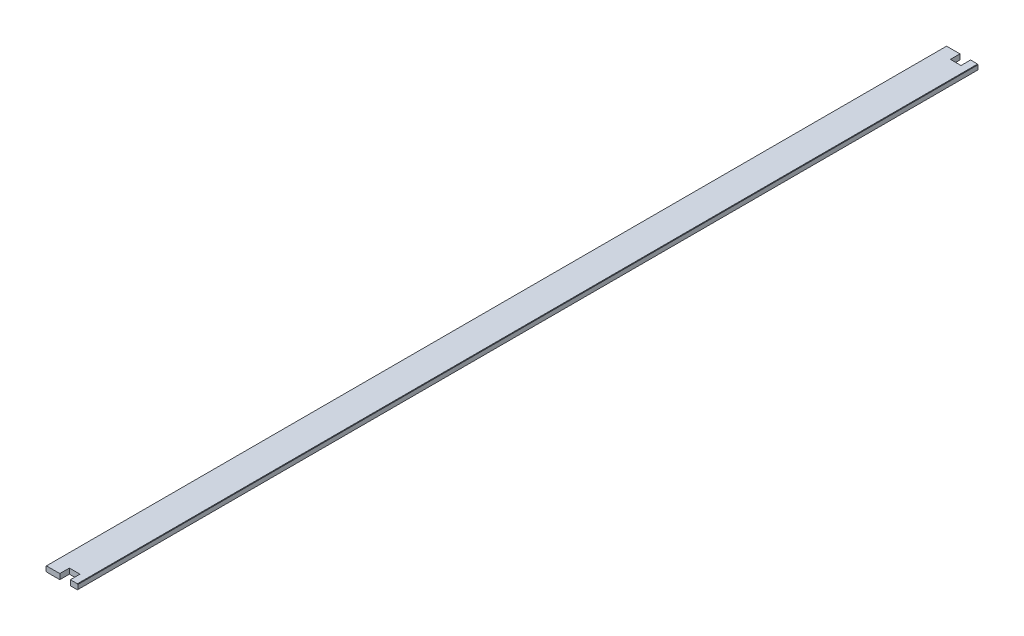
ISO-10303-21;
HEADER;
FILE_DESCRIPTION(('STEP AP214'),'2;1');
FILE_NAME('part.step','',(''),(''),'','','');
FILE_SCHEMA(('AUTOMOTIVE_DESIGN { 1 0 10303 214 1 1 1 1 }'));
ENDSEC;
DATA;
#1=APPLICATION_CONTEXT('core data for automotive mechanical design processes');
#2=APPLICATION_PROTOCOL_DEFINITION('international standard','automotive_design',2000,#1);
#3=PRODUCT_CONTEXT('',#1,'mechanical');
#4=PRODUCT('Part','Part','',(#3));
#5=PRODUCT_RELATED_PRODUCT_CATEGORY('part','',(#4));
#6=PRODUCT_DEFINITION_FORMATION('','',#4);
#7=PRODUCT_DEFINITION_CONTEXT('part definition',#1,'design');
#8=PRODUCT_DEFINITION('design','',#6,#7);
#9=PRODUCT_DEFINITION_SHAPE('','',#8);
#10=(LENGTH_UNIT() NAMED_UNIT(*) SI_UNIT(.MILLI.,.METRE.));
#11=(NAMED_UNIT(*) PLANE_ANGLE_UNIT() SI_UNIT($,.RADIAN.));
#12=(NAMED_UNIT(*) SI_UNIT($,.STERADIAN.) SOLID_ANGLE_UNIT());
#13=UNCERTAINTY_MEASURE_WITH_UNIT(LENGTH_MEASURE(1.E-05),#10,'distance_accuracy_value','');
#14=(GEOMETRIC_REPRESENTATION_CONTEXT(3) GLOBAL_UNCERTAINTY_ASSIGNED_CONTEXT((#13)) GLOBAL_UNIT_ASSIGNED_CONTEXT((#10,
#11,#12)) REPRESENTATION_CONTEXT('',''));
#15=CARTESIAN_POINT('',(0.,0.,0.));
#16=DIRECTION('',(0.,0.,1.));
#17=DIRECTION('',(1.,0.,0.));
#18=AXIS2_PLACEMENT_3D('',#15,#16,#17);
#19=CARTESIAN_POINT('',(0.,0.,4240.));
#20=DIRECTION('',(0.,0.,-1.));
#21=DIRECTION('',(-1.,0.,0.));
#22=AXIS2_PLACEMENT_3D('',#19,#20,#21);
#23=PLANE('',#22);
#24=DIRECTION('',(1.,0.,0.));
#25=VECTOR('',#24,1.);
#26=CARTESIAN_POINT('',(-73.,-12.5,4240.));
#27=LINE('',#26,#25);
#28=CARTESIAN_POINT('',(-73.,-12.5,4240.));
#29=VERTEX_POINT('',#28);
#30=CARTESIAN_POINT('',(-10.,-12.5,4240.));
#31=VERTEX_POINT('',#30);
#32=EDGE_CURVE('E223',#29,#31,#27,.T.);
#33=ORIENTED_EDGE('',*,*,#32,.T.);
#34=DIRECTION('',(0.,1.,0.));
#35=VECTOR('',#34,1.);
#36=CARTESIAN_POINT('',(-10.,-12.5,4240.));
#37=LINE('',#36,#35);
#38=CARTESIAN_POINT('',(-10.,12.5,4240.));
#39=VERTEX_POINT('',#38);
#40=EDGE_CURVE('E197',#31,#39,#37,.T.);
#41=ORIENTED_EDGE('',*,*,#40,.T.);
#42=DIRECTION('',(-1.,0.,0.));
#43=VECTOR('',#42,1.);
#44=CARTESIAN_POINT('',(-73.,12.5,4240.));
#45=LINE('',#44,#43);
#46=CARTESIAN_POINT('',(-73.,12.5,4240.));
#47=VERTEX_POINT('',#46);
#48=EDGE_CURVE('E216',#39,#47,#45,.T.);
#49=ORIENTED_EDGE('',*,*,#48,.T.);
#50=DIRECTION('',(-0.707106781186548,-0.707106781186547,0.));
#51=VECTOR('',#50,1.);
#52=CARTESIAN_POINT('',(-75.,10.5,4240.));
#53=LINE('',#52,#51);
#54=CARTESIAN_POINT('',(-75.,10.5,4240.));
#55=VERTEX_POINT('',#54);
#56=EDGE_CURVE('E215',#47,#55,#53,.T.);
#57=ORIENTED_EDGE('',*,*,#56,.T.);
#58=DIRECTION('',(0.,-1.,0.));
#59=VECTOR('',#58,1.);
#60=CARTESIAN_POINT('',(-75.,10.5,4240.));
#61=LINE('',#60,#59);
#62=CARTESIAN_POINT('',(-75.,-10.5,4240.));
#63=VERTEX_POINT('',#62);
#64=EDGE_CURVE('E218',#55,#63,#61,.T.);
#65=ORIENTED_EDGE('',*,*,#64,.T.);
#66=DIRECTION('',(0.707106781186548,-0.707106781186547,0.));
#67=VECTOR('',#66,1.);
#68=CARTESIAN_POINT('',(-75.,-10.5,4240.));
#69=LINE('',#68,#67);
#70=EDGE_CURVE('E220',#63,#29,#69,.T.);
#71=ORIENTED_EDGE('',*,*,#70,.T.);
#72=EDGE_LOOP('',(#33,#41,#49,#57,#65,#71));
#73=FACE_BOUND('',#72,.T.);
#74=ADVANCED_FACE('F37',(#73),#23,.F.);
#75=CARTESIAN_POINT('',(0.,0.,0.));
#76=DIRECTION('',(0.,0.,-1.));
#77=DIRECTION('',(-1.,0.,0.));
#78=AXIS2_PLACEMENT_3D('',#75,#76,#77);
#79=PLANE('',#78);
#80=DIRECTION('',(0.,1.,0.));
#81=VECTOR('',#80,1.);
#82=CARTESIAN_POINT('',(-10.,-12.5,0.));
#83=LINE('',#82,#81);
#84=CARTESIAN_POINT('',(-10.,-12.5,0.));
#85=VERTEX_POINT('',#84);
#86=CARTESIAN_POINT('',(-10.,12.5,0.));
#87=VERTEX_POINT('',#86);
#88=EDGE_CURVE('E183',#85,#87,#83,.T.);
#89=ORIENTED_EDGE('',*,*,#88,.F.);
#90=DIRECTION('',(1.,0.,0.));
#91=VECTOR('',#90,1.);
#92=CARTESIAN_POINT('',(-73.,-12.5,0.));
#93=LINE('',#92,#91);
#94=CARTESIAN_POINT('',(-73.,-12.5,0.));
#95=VERTEX_POINT('',#94);
#96=EDGE_CURVE('E174',#95,#85,#93,.T.);
#97=ORIENTED_EDGE('',*,*,#96,.F.);
#98=DIRECTION('',(0.707106781186548,-0.707106781186547,0.));
#99=VECTOR('',#98,1.);
#100=CARTESIAN_POINT('',(-75.,-10.5,0.));
#101=LINE('',#100,#99);
#102=CARTESIAN_POINT('',(-75.,-10.5,0.));
#103=VERTEX_POINT('',#102);
#104=EDGE_CURVE('E240',#103,#95,#101,.T.);
#105=ORIENTED_EDGE('',*,*,#104,.F.);
#106=DIRECTION('',(0.,-1.,0.));
#107=VECTOR('',#106,1.);
#108=CARTESIAN_POINT('',(-75.,10.5,0.));
#109=LINE('',#108,#107);
#110=CARTESIAN_POINT('',(-75.,10.5,0.));
#111=VERTEX_POINT('',#110);
#112=EDGE_CURVE('E238',#111,#103,#109,.T.);
#113=ORIENTED_EDGE('',*,*,#112,.F.);
#114=DIRECTION('',(-0.707106781186548,-0.707106781186547,0.));
#115=VECTOR('',#114,1.);
#116=CARTESIAN_POINT('',(-75.,10.5,0.));
#117=LINE('',#116,#115);
#118=CARTESIAN_POINT('',(-73.,12.5,0.));
#119=VERTEX_POINT('',#118);
#120=EDGE_CURVE('E236',#119,#111,#117,.T.);
#121=ORIENTED_EDGE('',*,*,#120,.F.);
#122=DIRECTION('',(-1.,0.,0.));
#123=VECTOR('',#122,1.);
#124=CARTESIAN_POINT('',(-73.,12.5,0.));
#125=LINE('',#124,#123);
#126=EDGE_CURVE('E185',#87,#119,#125,.T.);
#127=ORIENTED_EDGE('',*,*,#126,.F.);
#128=EDGE_LOOP('',(#89,#97,#105,#113,#121,#127));
#129=FACE_BOUND('',#128,.T.);
#130=ADVANCED_FACE('F277',(#129),#79,.T.);
#131=CARTESIAN_POINT('',(-73.,12.5,4240.));
#132=DIRECTION('',(0.,-1.,0.));
#133=DIRECTION('',(0.,0.,-1.));
#134=AXIS2_PLACEMENT_3D('',#131,#132,#133);
#135=PLANE('',#134);
#136=DIRECTION('',(1.,0.,0.));
#137=VECTOR('',#136,1.);
#138=CARTESIAN_POINT('',(-10.,12.5,45.));
#139=LINE('',#138,#137);
#140=CARTESIAN_POINT('',(-10.,12.5,45.));
#141=VERTEX_POINT('',#140);
#142=CARTESIAN_POINT('',(40.,12.5,45.));
#143=VERTEX_POINT('',#142);
#144=EDGE_CURVE('E176',#141,#143,#139,.T.);
#145=ORIENTED_EDGE('',*,*,#144,.F.);
#146=DIRECTION('',(0.,0.,1.));
#147=VECTOR('',#146,1.);
#148=CARTESIAN_POINT('',(-10.,12.5,0.));
#149=LINE('',#148,#147);
#150=EDGE_CURVE('E156',#87,#141,#149,.T.);
#151=ORIENTED_EDGE('',*,*,#150,.F.);
#152=ORIENTED_EDGE('',*,*,#126,.T.);
#153=DIRECTION('',(0.,0.,-1.));
#154=VECTOR('',#153,1.);
#155=CARTESIAN_POINT('',(-73.,12.5,4240.));
#156=LINE('',#155,#154);
#157=EDGE_CURVE('E11',#47,#119,#156,.T.);
#158=ORIENTED_EDGE('',*,*,#157,.F.);
#159=ORIENTED_EDGE('',*,*,#48,.F.);
#160=DIRECTION('',(0.,0.,1.));
#161=VECTOR('',#160,1.);
#162=CARTESIAN_POINT('',(-10.,12.5,4240.));
#163=LINE('',#162,#161);
#164=CARTESIAN_POINT('',(-10.,12.5,4195.));
#165=VERTEX_POINT('',#164);
#166=EDGE_CURVE('E198',#165,#39,#163,.T.);
#167=ORIENTED_EDGE('',*,*,#166,.F.);
#168=DIRECTION('',(-1.,0.,0.));
#169=VECTOR('',#168,1.);
#170=CARTESIAN_POINT('',(-10.,12.5,4195.));
#171=LINE('',#170,#169);
#172=CARTESIAN_POINT('',(40.,12.5,4195.));
#173=VERTEX_POINT('',#172);
#174=EDGE_CURVE('E192',#173,#165,#171,.T.);
#175=ORIENTED_EDGE('',*,*,#174,.F.);
#176=DIRECTION('',(0.,0.,-1.));
#177=VECTOR('',#176,1.);
#178=CARTESIAN_POINT('',(40.,12.5,4240.));
#179=LINE('',#178,#177);
#180=CARTESIAN_POINT('',(40.,12.5,4240.));
#181=VERTEX_POINT('',#180);
#182=EDGE_CURVE('E200',#181,#173,#179,.T.);
#183=ORIENTED_EDGE('',*,*,#182,.F.);
#184=CARTESIAN_POINT('',(73.,12.5,4240.));
#185=VERTEX_POINT('',#184);
#186=EDGE_CURVE('E212',#185,#181,#45,.T.);
#187=ORIENTED_EDGE('',*,*,#186,.F.);
#188=DIRECTION('',(0.,0.,-1.));
#189=VECTOR('',#188,1.);
#190=CARTESIAN_POINT('',(73.,12.5,4240.));
#191=LINE('',#190,#189);
#192=CARTESIAN_POINT('',(73.,12.5,0.));
#193=VERTEX_POINT('',#192);
#194=EDGE_CURVE('E232',#185,#193,#191,.T.);
#195=ORIENTED_EDGE('',*,*,#194,.T.);
#196=CARTESIAN_POINT('',(40.,12.5,0.));
#197=VERTEX_POINT('',#196);
#198=EDGE_CURVE('E233',#193,#197,#125,.T.);
#199=ORIENTED_EDGE('',*,*,#198,.T.);
#200=DIRECTION('',(0.,0.,-1.));
#201=VECTOR('',#200,1.);
#202=CARTESIAN_POINT('',(40.,12.5,0.));
#203=LINE('',#202,#201);
#204=EDGE_CURVE('E60',#143,#197,#203,.T.);
#205=ORIENTED_EDGE('',*,*,#204,.F.);
#206=EDGE_LOOP('',(#145,#151,#152,#158,#159,#167,#175,#183,#187,#195,#199,#205));
#207=FACE_BOUND('',#206,.T.);
#208=ADVANCED_FACE('F39',(#207),#135,.F.);
#209=CARTESIAN_POINT('',(-75.,10.5,4240.));
#210=DIRECTION('',(0.707106781186547,-0.707106781186548,0.));
#211=DIRECTION('',(0.707106781186548,0.707106781186547,0.));
#212=AXIS2_PLACEMENT_3D('',#209,#210,#211);
#213=PLANE('',#212);
#214=ORIENTED_EDGE('',*,*,#120,.T.);
#215=DIRECTION('',(0.,0.,-1.));
#216=VECTOR('',#215,1.);
#217=CARTESIAN_POINT('',(-75.,10.5,4240.));
#218=LINE('',#217,#216);
#219=EDGE_CURVE('E45',#55,#111,#218,.T.);
#220=ORIENTED_EDGE('',*,*,#219,.F.);
#221=ORIENTED_EDGE('',*,*,#56,.F.);
#222=ORIENTED_EDGE('',*,*,#157,.T.);
#223=EDGE_LOOP('',(#214,#220,#221,#222));
#224=FACE_BOUND('',#223,.T.);
#225=ADVANCED_FACE('F288',(#224),#213,.F.);
#226=CARTESIAN_POINT('',(-75.,10.5,4240.));
#227=DIRECTION('',(1.,0.,0.));
#228=DIRECTION('',(0.,0.,-1.));
#229=AXIS2_PLACEMENT_3D('',#226,#227,#228);
#230=PLANE('',#229);
#231=ORIENTED_EDGE('',*,*,#112,.T.);
#232=DIRECTION('',(0.,0.,-1.));
#233=VECTOR('',#232,1.);
#234=CARTESIAN_POINT('',(-75.,-10.5,4240.));
#235=LINE('',#234,#233);
#236=EDGE_CURVE('E263',#63,#103,#235,.T.);
#237=ORIENTED_EDGE('',*,*,#236,.F.);
#238=ORIENTED_EDGE('',*,*,#64,.F.);
#239=ORIENTED_EDGE('',*,*,#219,.T.);
#240=EDGE_LOOP('',(#231,#237,#238,#239));
#241=FACE_BOUND('',#240,.T.);
#242=ADVANCED_FACE('F270',(#241),#230,.F.);
#243=CARTESIAN_POINT('',(-75.,-10.5,4240.));
#244=DIRECTION('',(0.707106781186547,0.707106781186548,0.));
#245=DIRECTION('',(-0.707106781186548,0.707106781186547,0.));
#246=AXIS2_PLACEMENT_3D('',#243,#244,#245);
#247=PLANE('',#246);
#248=ORIENTED_EDGE('',*,*,#104,.T.);
#249=DIRECTION('',(0.,0.,-1.));
#250=VECTOR('',#249,1.);
#251=CARTESIAN_POINT('',(-73.,-12.5,4240.));
#252=LINE('',#251,#250);
#253=EDGE_CURVE('E261',#29,#95,#252,.T.);
#254=ORIENTED_EDGE('',*,*,#253,.F.);
#255=ORIENTED_EDGE('',*,*,#70,.F.);
#256=ORIENTED_EDGE('',*,*,#236,.T.);
#257=EDGE_LOOP('',(#248,#254,#255,#256));
#258=FACE_BOUND('',#257,.T.);
#259=ADVANCED_FACE('F281',(#258),#247,.F.);
#260=CARTESIAN_POINT('',(-73.,-12.5,4240.));
#261=DIRECTION('',(0.,1.,0.));
#262=DIRECTION('',(0.,0.,1.));
#263=AXIS2_PLACEMENT_3D('',#260,#261,#262);
#264=PLANE('',#263);
#265=ORIENTED_EDGE('',*,*,#96,.T.);
#266=DIRECTION('',(0.,0.,1.));
#267=VECTOR('',#266,1.);
#268=CARTESIAN_POINT('',(-10.,-12.5,0.));
#269=LINE('',#268,#267);
#270=CARTESIAN_POINT('',(-10.,-12.5,45.));
#271=VERTEX_POINT('',#270);
#272=EDGE_CURVE('E153',#85,#271,#269,.T.);
#273=ORIENTED_EDGE('',*,*,#272,.T.);
#274=DIRECTION('',(1.,0.,0.));
#275=VECTOR('',#274,1.);
#276=CARTESIAN_POINT('',(-10.,-12.5,45.));
#277=LINE('',#276,#275);
#278=CARTESIAN_POINT('',(40.,-12.5,45.));
#279=VERTEX_POINT('',#278);
#280=EDGE_CURVE('E164',#271,#279,#277,.T.);
#281=ORIENTED_EDGE('',*,*,#280,.T.);
#282=DIRECTION('',(0.,0.,-1.));
#283=VECTOR('',#282,1.);
#284=CARTESIAN_POINT('',(40.,-12.5,0.));
#285=LINE('',#284,#283);
#286=CARTESIAN_POINT('',(40.,-12.5,0.));
#287=VERTEX_POINT('',#286);
#288=EDGE_CURVE('E161',#279,#287,#285,.T.);
#289=ORIENTED_EDGE('',*,*,#288,.T.);
#290=CARTESIAN_POINT('',(73.,-12.5,0.));
#291=VERTEX_POINT('',#290);
#292=EDGE_CURVE('E242',#287,#291,#93,.T.);
#293=ORIENTED_EDGE('',*,*,#292,.T.);
#294=DIRECTION('',(0.,0.,-1.));
#295=VECTOR('',#294,1.);
#296=CARTESIAN_POINT('',(73.,-12.5,4240.));
#297=LINE('',#296,#295);
#298=CARTESIAN_POINT('',(73.,-12.5,4240.));
#299=VERTEX_POINT('',#298);
#300=EDGE_CURVE('E258',#299,#291,#297,.T.);
#301=ORIENTED_EDGE('',*,*,#300,.F.);
#302=CARTESIAN_POINT('',(40.,-12.5,4240.));
#303=VERTEX_POINT('',#302);
#304=EDGE_CURVE('E222',#303,#299,#27,.T.);
#305=ORIENTED_EDGE('',*,*,#304,.F.);
#306=DIRECTION('',(0.,0.,-1.));
#307=VECTOR('',#306,1.);
#308=CARTESIAN_POINT('',(40.,-12.5,4240.));
#309=LINE('',#308,#307);
#310=CARTESIAN_POINT('',(40.,-12.5,4195.));
#311=VERTEX_POINT('',#310);
#312=EDGE_CURVE('E52',#303,#311,#309,.T.);
#313=ORIENTED_EDGE('',*,*,#312,.T.);
#314=DIRECTION('',(-1.,0.,0.));
#315=VECTOR('',#314,1.);
#316=CARTESIAN_POINT('',(-10.,-12.5,4195.));
#317=LINE('',#316,#315);
#318=CARTESIAN_POINT('',(-10.,-12.5,4195.));
#319=VERTEX_POINT('',#318);
#320=EDGE_CURVE('E194',#311,#319,#317,.T.);
#321=ORIENTED_EDGE('',*,*,#320,.T.);
#322=DIRECTION('',(0.,0.,1.));
#323=VECTOR('',#322,1.);
#324=CARTESIAN_POINT('',(-10.,-12.5,4240.));
#325=LINE('',#324,#323);
#326=EDGE_CURVE('E189',#319,#31,#325,.T.);
#327=ORIENTED_EDGE('',*,*,#326,.T.);
#328=ORIENTED_EDGE('',*,*,#32,.F.);
#329=ORIENTED_EDGE('',*,*,#253,.T.);
#330=EDGE_LOOP('',(#265,#273,#281,#289,#293,#301,#305,#313,#321,#327,#328,#329));
#331=FACE_BOUND('',#330,.T.);
#332=ADVANCED_FACE('F171',(#331),#264,.F.);
#333=CARTESIAN_POINT('',(73.,-12.5,4240.));
#334=DIRECTION('',(-0.707106781186547,0.707106781186548,0.));
#335=DIRECTION('',(-0.707106781186548,-0.707106781186547,0.));
#336=AXIS2_PLACEMENT_3D('',#333,#334,#335);
#337=PLANE('',#336);
#338=DIRECTION('',(0.707106781186548,0.707106781186547,0.));
#339=VECTOR('',#338,1.);
#340=CARTESIAN_POINT('',(73.,-12.5,0.));
#341=LINE('',#340,#339);
#342=CARTESIAN_POINT('',(75.,-10.5,0.));
#343=VERTEX_POINT('',#342);
#344=EDGE_CURVE('E244',#291,#343,#341,.T.);
#345=ORIENTED_EDGE('',*,*,#344,.T.);
#346=DIRECTION('',(0.,0.,-1.));
#347=VECTOR('',#346,1.);
#348=CARTESIAN_POINT('',(75.,-10.5,4240.));
#349=LINE('',#348,#347);
#350=CARTESIAN_POINT('',(75.,-10.5,4240.));
#351=VERTEX_POINT('',#350);
#352=EDGE_CURVE('E255',#351,#343,#349,.T.);
#353=ORIENTED_EDGE('',*,*,#352,.F.);
#354=DIRECTION('',(0.707106781186548,0.707106781186547,0.));
#355=VECTOR('',#354,1.);
#356=CARTESIAN_POINT('',(73.,-12.5,4240.));
#357=LINE('',#356,#355);
#358=EDGE_CURVE('E226',#299,#351,#357,.T.);
#359=ORIENTED_EDGE('',*,*,#358,.F.);
#360=ORIENTED_EDGE('',*,*,#300,.T.);
#361=EDGE_LOOP('',(#345,#353,#359,#360));
#362=FACE_BOUND('',#361,.T.);
#363=ADVANCED_FACE('F305',(#362),#337,.F.);
#364=CARTESIAN_POINT('',(75.,10.5,4240.));
#365=DIRECTION('',(-1.,0.,0.));
#366=DIRECTION('',(0.,0.,1.));
#367=AXIS2_PLACEMENT_3D('',#364,#365,#366);
#368=PLANE('',#367);
#369=DIRECTION('',(0.,1.,0.));
#370=VECTOR('',#369,1.);
#371=CARTESIAN_POINT('',(75.,10.5,0.));
#372=LINE('',#371,#370);
#373=CARTESIAN_POINT('',(75.,10.5,0.));
#374=VERTEX_POINT('',#373);
#375=EDGE_CURVE('E246',#343,#374,#372,.T.);
#376=ORIENTED_EDGE('',*,*,#375,.T.);
#377=DIRECTION('',(0.,0.,-1.));
#378=VECTOR('',#377,1.);
#379=CARTESIAN_POINT('',(75.,10.5,4240.));
#380=LINE('',#379,#378);
#381=CARTESIAN_POINT('',(75.,10.5,4240.));
#382=VERTEX_POINT('',#381);
#383=EDGE_CURVE('E252',#382,#374,#380,.T.);
#384=ORIENTED_EDGE('',*,*,#383,.F.);
#385=DIRECTION('',(0.,1.,0.));
#386=VECTOR('',#385,1.);
#387=CARTESIAN_POINT('',(75.,10.5,4240.));
#388=LINE('',#387,#386);
#389=EDGE_CURVE('E228',#351,#382,#388,.T.);
#390=ORIENTED_EDGE('',*,*,#389,.F.);
#391=ORIENTED_EDGE('',*,*,#352,.T.);
#392=EDGE_LOOP('',(#376,#384,#390,#391));
#393=FACE_BOUND('',#392,.T.);
#394=ADVANCED_FACE('F309',(#393),#368,.F.);
#395=CARTESIAN_POINT('',(73.,12.5,4240.));
#396=DIRECTION('',(-0.707106781186547,-0.707106781186548,0.));
#397=DIRECTION('',(0.707106781186548,-0.707106781186547,0.));
#398=AXIS2_PLACEMENT_3D('',#395,#396,#397);
#399=PLANE('',#398);
#400=DIRECTION('',(-0.707106781186548,0.707106781186547,0.));
#401=VECTOR('',#400,1.);
#402=CARTESIAN_POINT('',(73.,12.5,0.));
#403=LINE('',#402,#401);
#404=EDGE_CURVE('E248',#374,#193,#403,.T.);
#405=ORIENTED_EDGE('',*,*,#404,.T.);
#406=ORIENTED_EDGE('',*,*,#194,.F.);
#407=DIRECTION('',(-0.707106781186548,0.707106781186547,0.));
#408=VECTOR('',#407,1.);
#409=CARTESIAN_POINT('',(73.,12.5,4240.));
#410=LINE('',#409,#408);
#411=EDGE_CURVE('E230',#382,#185,#410,.T.);
#412=ORIENTED_EDGE('',*,*,#411,.F.);
#413=ORIENTED_EDGE('',*,*,#383,.T.);
#414=EDGE_LOOP('',(#405,#406,#412,#413));
#415=FACE_BOUND('',#414,.T.);
#416=ADVANCED_FACE('F313',(#415),#399,.F.);
#417=ORIENTED_EDGE('',*,*,#186,.T.);
#418=DIRECTION('',(0.,1.,0.));
#419=VECTOR('',#418,1.);
#420=CARTESIAN_POINT('',(40.,-12.5,4240.));
#421=LINE('',#420,#419);
#422=EDGE_CURVE('E208',#303,#181,#421,.T.);
#423=ORIENTED_EDGE('',*,*,#422,.F.);
#424=ORIENTED_EDGE('',*,*,#304,.T.);
#425=ORIENTED_EDGE('',*,*,#358,.T.);
#426=ORIENTED_EDGE('',*,*,#389,.T.);
#427=ORIENTED_EDGE('',*,*,#411,.T.);
#428=EDGE_LOOP('',(#417,#423,#424,#425,#426,#427));
#429=FACE_BOUND('',#428,.T.);
#430=ADVANCED_FACE('F315',(#429),#23,.F.);
#431=DIRECTION('',(0.,1.,0.));
#432=VECTOR('',#431,1.);
#433=CARTESIAN_POINT('',(40.,-12.5,0.));
#434=LINE('',#433,#432);
#435=EDGE_CURVE('E186',#287,#197,#434,.T.);
#436=ORIENTED_EDGE('',*,*,#435,.T.);
#437=ORIENTED_EDGE('',*,*,#198,.F.);
#438=ORIENTED_EDGE('',*,*,#404,.F.);
#439=ORIENTED_EDGE('',*,*,#375,.F.);
#440=ORIENTED_EDGE('',*,*,#344,.F.);
#441=ORIENTED_EDGE('',*,*,#292,.F.);
#442=EDGE_LOOP('',(#436,#437,#438,#439,#440,#441));
#443=FACE_BOUND('',#442,.T.);
#444=ADVANCED_FACE('F296',(#443),#79,.T.);
#445=CARTESIAN_POINT('',(-10.,-12.5,0.));
#446=DIRECTION('',(-1.,0.,0.));
#447=DIRECTION('',(0.,0.,1.));
#448=AXIS2_PLACEMENT_3D('',#445,#446,#447);
#449=PLANE('',#448);
#450=ORIENTED_EDGE('',*,*,#150,.T.);
#451=DIRECTION('',(0.,1.,0.));
#452=VECTOR('',#451,1.);
#453=CARTESIAN_POINT('',(-10.,-12.5,45.));
#454=LINE('',#453,#452);
#455=EDGE_CURVE('E149',#271,#141,#454,.T.);
#456=ORIENTED_EDGE('',*,*,#455,.F.);
#457=ORIENTED_EDGE('',*,*,#272,.F.);
#458=ORIENTED_EDGE('',*,*,#88,.T.);
#459=EDGE_LOOP('',(#450,#456,#457,#458));
#460=FACE_BOUND('',#459,.T.);
#461=ADVANCED_FACE('F151',(#460),#449,.F.);
#462=CARTESIAN_POINT('',(40.,-12.5,0.));
#463=DIRECTION('',(1.,0.,0.));
#464=DIRECTION('',(0.,0.,-1.));
#465=AXIS2_PLACEMENT_3D('',#462,#463,#464);
#466=PLANE('',#465);
#467=ORIENTED_EDGE('',*,*,#204,.T.);
#468=ORIENTED_EDGE('',*,*,#435,.F.);
#469=ORIENTED_EDGE('',*,*,#288,.F.);
#470=DIRECTION('',(0.,1.,0.));
#471=VECTOR('',#470,1.);
#472=CARTESIAN_POINT('',(40.,-12.5,45.));
#473=LINE('',#472,#471);
#474=EDGE_CURVE('E160',#279,#143,#473,.T.);
#475=ORIENTED_EDGE('',*,*,#474,.T.);
#476=EDGE_LOOP('',(#467,#468,#469,#475));
#477=FACE_BOUND('',#476,.T.);
#478=ADVANCED_FACE('F300',(#477),#466,.F.);
#479=CARTESIAN_POINT('',(-10.,-12.5,45.));
#480=DIRECTION('',(0.,0.,1.));
#481=DIRECTION('',(1.,0.,0.));
#482=AXIS2_PLACEMENT_3D('',#479,#480,#481);
#483=PLANE('',#482);
#484=ORIENTED_EDGE('',*,*,#144,.T.);
#485=ORIENTED_EDGE('',*,*,#474,.F.);
#486=ORIENTED_EDGE('',*,*,#280,.F.);
#487=ORIENTED_EDGE('',*,*,#455,.T.);
#488=EDGE_LOOP('',(#484,#485,#486,#487));
#489=FACE_BOUND('',#488,.T.);
#490=ADVANCED_FACE('F165',(#489),#483,.F.);
#491=CARTESIAN_POINT('',(-10.,-12.5,4240.));
#492=DIRECTION('',(-1.,0.,0.));
#493=DIRECTION('',(0.,0.,1.));
#494=AXIS2_PLACEMENT_3D('',#491,#492,#493);
#495=PLANE('',#494);
#496=ORIENTED_EDGE('',*,*,#166,.T.);
#497=ORIENTED_EDGE('',*,*,#40,.F.);
#498=ORIENTED_EDGE('',*,*,#326,.F.);
#499=DIRECTION('',(0.,1.,0.));
#500=VECTOR('',#499,1.);
#501=CARTESIAN_POINT('',(-10.,-12.5,4195.));
#502=LINE('',#501,#500);
#503=EDGE_CURVE('E181',#319,#165,#502,.T.);
#504=ORIENTED_EDGE('',*,*,#503,.T.);
#505=EDGE_LOOP('',(#496,#497,#498,#504));
#506=FACE_BOUND('',#505,.T.);
#507=ADVANCED_FACE('F321',(#506),#495,.F.);
#508=CARTESIAN_POINT('',(-10.,-12.5,4195.));
#509=DIRECTION('',(0.,0.,-1.));
#510=DIRECTION('',(-1.,0.,0.));
#511=AXIS2_PLACEMENT_3D('',#508,#509,#510);
#512=PLANE('',#511);
#513=ORIENTED_EDGE('',*,*,#174,.T.);
#514=ORIENTED_EDGE('',*,*,#503,.F.);
#515=ORIENTED_EDGE('',*,*,#320,.F.);
#516=DIRECTION('',(0.,1.,0.));
#517=VECTOR('',#516,1.);
#518=CARTESIAN_POINT('',(40.,-12.5,4195.));
#519=LINE('',#518,#517);
#520=EDGE_CURVE('E206',#311,#173,#519,.T.);
#521=ORIENTED_EDGE('',*,*,#520,.T.);
#522=EDGE_LOOP('',(#513,#514,#515,#521));
#523=FACE_BOUND('',#522,.T.);
#524=ADVANCED_FACE('F318',(#523),#512,.F.);
#525=CARTESIAN_POINT('',(40.,-12.5,4240.));
#526=DIRECTION('',(1.,0.,0.));
#527=DIRECTION('',(0.,0.,-1.));
#528=AXIS2_PLACEMENT_3D('',#525,#526,#527);
#529=PLANE('',#528);
#530=ORIENTED_EDGE('',*,*,#182,.T.);
#531=ORIENTED_EDGE('',*,*,#520,.F.);
#532=ORIENTED_EDGE('',*,*,#312,.F.);
#533=ORIENTED_EDGE('',*,*,#422,.T.);
#534=EDGE_LOOP('',(#530,#531,#532,#533));
#535=FACE_BOUND('',#534,.T.);
#536=ADVANCED_FACE('F323',(#535),#529,.F.);
#537=CLOSED_SHELL('',(#74,#130,#208,#225,#242,#259,#332,#363,#394,#416,#430,#444,#461,#478,#490,
#507,#524,#536));
#538=MANIFOLD_SOLID_BREP('B2',#537);
#539=ADVANCED_BREP_SHAPE_REPRESENTATION('',(#18,#538),#14);
#540=SHAPE_DEFINITION_REPRESENTATION(#9,#539);
ENDSEC;
END-ISO-10303-21;
